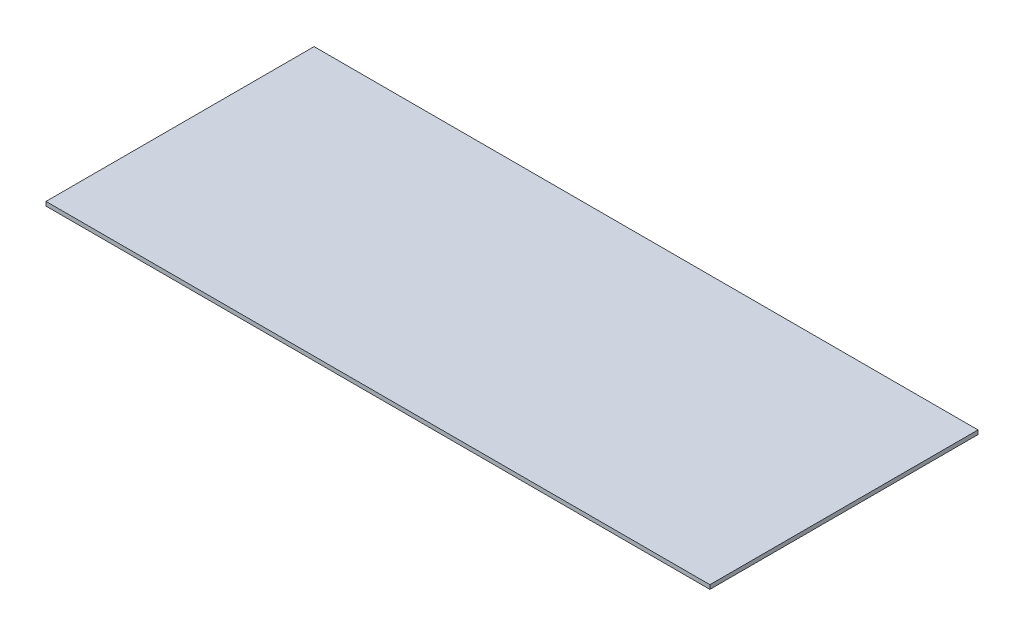
ISO-10303-21;
HEADER;
FILE_DESCRIPTION(('STEP AP214'),'2;1');
FILE_NAME('part.step','',(''),(''),'','','');
FILE_SCHEMA(('AUTOMOTIVE_DESIGN { 1 0 10303 214 1 1 1 1 }'));
ENDSEC;
DATA;
#1=APPLICATION_CONTEXT('core data for automotive mechanical design processes');
#2=APPLICATION_PROTOCOL_DEFINITION('international standard','automotive_design',2000,#1);
#3=PRODUCT_CONTEXT('',#1,'mechanical');
#4=PRODUCT('Part','Part','',(#3));
#5=PRODUCT_RELATED_PRODUCT_CATEGORY('part','',(#4));
#6=PRODUCT_DEFINITION_FORMATION('','',#4);
#7=PRODUCT_DEFINITION_CONTEXT('part definition',#1,'design');
#8=PRODUCT_DEFINITION('design','',#6,#7);
#9=PRODUCT_DEFINITION_SHAPE('','',#8);
#10=(LENGTH_UNIT() NAMED_UNIT(*) SI_UNIT(.MILLI.,.METRE.));
#11=(NAMED_UNIT(*) PLANE_ANGLE_UNIT() SI_UNIT($,.RADIAN.));
#12=(NAMED_UNIT(*) SI_UNIT($,.STERADIAN.) SOLID_ANGLE_UNIT());
#13=UNCERTAINTY_MEASURE_WITH_UNIT(LENGTH_MEASURE(1.E-05),#10,'distance_accuracy_value','');
#14=(GEOMETRIC_REPRESENTATION_CONTEXT(3) GLOBAL_UNCERTAINTY_ASSIGNED_CONTEXT((#13)) GLOBAL_UNIT_ASSIGNED_CONTEXT((#10,
#11,#12)) REPRESENTATION_CONTEXT('',''));
#15=CARTESIAN_POINT('',(0.,0.,0.));
#16=DIRECTION('',(0.,0.,1.));
#17=DIRECTION('',(1.,0.,0.));
#18=AXIS2_PLACEMENT_3D('',#15,#16,#17);
#19=CARTESIAN_POINT('',(0.,16.,0.));
#20=DIRECTION('',(1.,0.,0.));
#21=DIRECTION('',(0.,0.,-1.));
#22=AXIS2_PLACEMENT_3D('',#19,#20,#21);
#23=PLANE('',#22);
#24=DIRECTION('',(0.,0.,1.));
#25=VECTOR('',#24,1.);
#26=CARTESIAN_POINT('',(0.,0.,0.));
#27=LINE('',#26,#25);
#28=CARTESIAN_POINT('',(0.,0.,-1050.));
#29=VERTEX_POINT('',#28);
#30=CARTESIAN_POINT('',(0.,0.,0.));
#31=VERTEX_POINT('',#30);
#32=EDGE_CURVE('E96',#29,#31,#27,.T.);
#33=ORIENTED_EDGE('',*,*,#32,.T.);
#34=DIRECTION('',(0.,-1.,0.));
#35=VECTOR('',#34,1.);
#36=CARTESIAN_POINT('',(0.,16.,0.));
#37=LINE('',#36,#35);
#38=CARTESIAN_POINT('',(0.,16.,0.));
#39=VERTEX_POINT('',#38);
#40=EDGE_CURVE('E11',#39,#31,#37,.T.);
#41=ORIENTED_EDGE('',*,*,#40,.F.);
#42=DIRECTION('',(0.,0.,1.));
#43=VECTOR('',#42,1.);
#44=CARTESIAN_POINT('',(0.,16.,0.));
#45=LINE('',#44,#43);
#46=CARTESIAN_POINT('',(0.,16.,-1050.));
#47=VERTEX_POINT('',#46);
#48=EDGE_CURVE('E84',#47,#39,#45,.T.);
#49=ORIENTED_EDGE('',*,*,#48,.F.);
#50=DIRECTION('',(0.,-1.,0.));
#51=VECTOR('',#50,1.);
#52=CARTESIAN_POINT('',(0.,16.,-1050.));
#53=LINE('',#52,#51);
#54=EDGE_CURVE('E92',#47,#29,#53,.T.);
#55=ORIENTED_EDGE('',*,*,#54,.T.);
#56=EDGE_LOOP('',(#33,#41,#49,#55));
#57=FACE_BOUND('',#56,.T.);
#58=ADVANCED_FACE('F33',(#57),#23,.F.);
#59=CARTESIAN_POINT('',(0.,16.,0.));
#60=DIRECTION('',(0.,0.,-1.));
#61=DIRECTION('',(-1.,0.,0.));
#62=AXIS2_PLACEMENT_3D('',#59,#60,#61);
#63=PLANE('',#62);
#64=DIRECTION('',(1.,0.,0.));
#65=VECTOR('',#64,1.);
#66=CARTESIAN_POINT('',(0.,0.,0.));
#67=LINE('',#66,#65);
#68=CARTESIAN_POINT('',(2600.,0.,0.));
#69=VERTEX_POINT('',#68);
#70=EDGE_CURVE('E88',#31,#69,#67,.T.);
#71=ORIENTED_EDGE('',*,*,#70,.T.);
#72=DIRECTION('',(0.,-1.,0.));
#73=VECTOR('',#72,1.);
#74=CARTESIAN_POINT('',(2600.,16.,0.));
#75=LINE('',#74,#73);
#76=CARTESIAN_POINT('',(2600.,16.,0.));
#77=VERTEX_POINT('',#76);
#78=EDGE_CURVE('E41',#77,#69,#75,.T.);
#79=ORIENTED_EDGE('',*,*,#78,.F.);
#80=DIRECTION('',(1.,0.,0.));
#81=VECTOR('',#80,1.);
#82=CARTESIAN_POINT('',(0.,16.,0.));
#83=LINE('',#82,#81);
#84=EDGE_CURVE('E79',#39,#77,#83,.T.);
#85=ORIENTED_EDGE('',*,*,#84,.F.);
#86=ORIENTED_EDGE('',*,*,#40,.T.);
#87=EDGE_LOOP('',(#71,#79,#85,#86));
#88=FACE_BOUND('',#87,.T.);
#89=ADVANCED_FACE('F87',(#88),#63,.F.);
#90=CARTESIAN_POINT('',(2600.,16.,0.));
#91=DIRECTION('',(-1.,0.,0.));
#92=DIRECTION('',(0.,0.,1.));
#93=AXIS2_PLACEMENT_3D('',#90,#91,#92);
#94=PLANE('',#93);
#95=DIRECTION('',(0.,0.,-1.));
#96=VECTOR('',#95,1.);
#97=CARTESIAN_POINT('',(2600.,0.,0.));
#98=LINE('',#97,#96);
#99=CARTESIAN_POINT('',(2600.,0.,-1050.));
#100=VERTEX_POINT('',#99);
#101=EDGE_CURVE('E66',#69,#100,#98,.T.);
#102=ORIENTED_EDGE('',*,*,#101,.T.);
#103=DIRECTION('',(0.,-1.,0.));
#104=VECTOR('',#103,1.);
#105=CARTESIAN_POINT('',(2600.,16.,-1050.));
#106=LINE('',#105,#104);
#107=CARTESIAN_POINT('',(2600.,16.,-1050.));
#108=VERTEX_POINT('',#107);
#109=EDGE_CURVE('E89',#108,#100,#106,.T.);
#110=ORIENTED_EDGE('',*,*,#109,.F.);
#111=DIRECTION('',(0.,0.,-1.));
#112=VECTOR('',#111,1.);
#113=CARTESIAN_POINT('',(2600.,16.,0.));
#114=LINE('',#113,#112);
#115=EDGE_CURVE('E82',#77,#108,#114,.T.);
#116=ORIENTED_EDGE('',*,*,#115,.F.);
#117=ORIENTED_EDGE('',*,*,#78,.T.);
#118=EDGE_LOOP('',(#102,#110,#116,#117));
#119=FACE_BOUND('',#118,.T.);
#120=ADVANCED_FACE('F90',(#119),#94,.F.);
#121=CARTESIAN_POINT('',(0.,16.,-1050.));
#122=DIRECTION('',(0.,0.,1.));
#123=DIRECTION('',(1.,0.,0.));
#124=AXIS2_PLACEMENT_3D('',#121,#122,#123);
#125=PLANE('',#124);
#126=DIRECTION('',(-1.,0.,0.));
#127=VECTOR('',#126,1.);
#128=CARTESIAN_POINT('',(0.,0.,-1050.));
#129=LINE('',#128,#127);
#130=EDGE_CURVE('E72',#100,#29,#129,.T.);
#131=ORIENTED_EDGE('',*,*,#130,.T.);
#132=ORIENTED_EDGE('',*,*,#54,.F.);
#133=DIRECTION('',(-1.,0.,0.));
#134=VECTOR('',#133,1.);
#135=CARTESIAN_POINT('',(0.,16.,-1050.));
#136=LINE('',#135,#134);
#137=EDGE_CURVE('E49',#108,#47,#136,.T.);
#138=ORIENTED_EDGE('',*,*,#137,.F.);
#139=ORIENTED_EDGE('',*,*,#109,.T.);
#140=EDGE_LOOP('',(#131,#132,#138,#139));
#141=FACE_BOUND('',#140,.T.);
#142=ADVANCED_FACE('F103',(#141),#125,.F.);
#143=CARTESIAN_POINT('',(0.,16.,0.));
#144=DIRECTION('',(0.,-1.,0.));
#145=DIRECTION('',(0.,0.,-1.));
#146=AXIS2_PLACEMENT_3D('',#143,#144,#145);
#147=PLANE('',#146);
#148=ORIENTED_EDGE('',*,*,#48,.T.);
#149=ORIENTED_EDGE('',*,*,#84,.T.);
#150=ORIENTED_EDGE('',*,*,#115,.T.);
#151=ORIENTED_EDGE('',*,*,#137,.T.);
#152=EDGE_LOOP('',(#148,#149,#150,#151));
#153=FACE_BOUND('',#152,.T.);
#154=ADVANCED_FACE('F80',(#153),#147,.F.);
#155=CARTESIAN_POINT('',(0.,0.,0.));
#156=DIRECTION('',(0.,-1.,0.));
#157=DIRECTION('',(0.,0.,-1.));
#158=AXIS2_PLACEMENT_3D('',#155,#156,#157);
#159=PLANE('',#158);
#160=ORIENTED_EDGE('',*,*,#32,.F.);
#161=ORIENTED_EDGE('',*,*,#130,.F.);
#162=ORIENTED_EDGE('',*,*,#101,.F.);
#163=ORIENTED_EDGE('',*,*,#70,.F.);
#164=EDGE_LOOP('',(#160,#161,#162,#163));
#165=FACE_BOUND('',#164,.T.);
#166=ADVANCED_FACE('F106',(#165),#159,.T.);
#167=CLOSED_SHELL('',(#58,#89,#120,#142,#154,#166));
#168=MANIFOLD_SOLID_BREP('B2',#167);
#169=ADVANCED_BREP_SHAPE_REPRESENTATION('',(#18,#168),#14);
#170=SHAPE_DEFINITION_REPRESENTATION(#9,#169);
ENDSEC;
END-ISO-10303-21;
